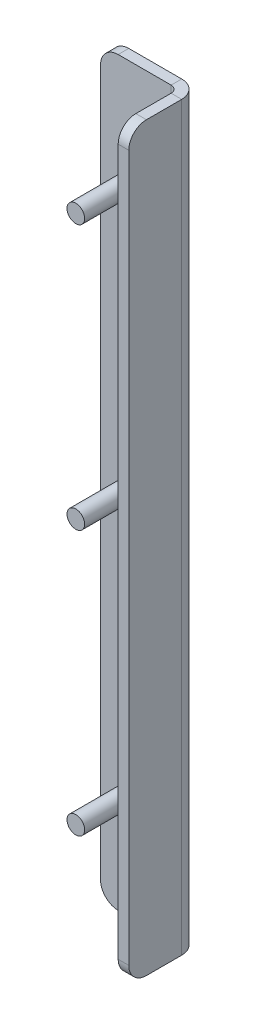
ISO-10303-21;
HEADER;
FILE_DESCRIPTION(('STEP AP214'),'2;1');
FILE_NAME('part.step','',(''),(''),'','','');
FILE_SCHEMA(('AUTOMOTIVE_DESIGN { 1 0 10303 214 1 1 1 1 }'));
ENDSEC;
DATA;
#1=APPLICATION_CONTEXT('core data for automotive mechanical design processes');
#2=APPLICATION_PROTOCOL_DEFINITION('international standard','automotive_design',2000,#1);
#3=PRODUCT_CONTEXT('',#1,'mechanical');
#4=PRODUCT('Part','Part','',(#3));
#5=PRODUCT_RELATED_PRODUCT_CATEGORY('part','',(#4));
#6=PRODUCT_DEFINITION_FORMATION('','',#4);
#7=PRODUCT_DEFINITION_CONTEXT('part definition',#1,'design');
#8=PRODUCT_DEFINITION('design','',#6,#7);
#9=PRODUCT_DEFINITION_SHAPE('','',#8);
#10=(LENGTH_UNIT() NAMED_UNIT(*) SI_UNIT(.MILLI.,.METRE.));
#11=(NAMED_UNIT(*) PLANE_ANGLE_UNIT() SI_UNIT($,.RADIAN.));
#12=(NAMED_UNIT(*) SI_UNIT($,.STERADIAN.) SOLID_ANGLE_UNIT());
#13=UNCERTAINTY_MEASURE_WITH_UNIT(LENGTH_MEASURE(1.E-05),#10,'distance_accuracy_value','');
#14=(GEOMETRIC_REPRESENTATION_CONTEXT(3) GLOBAL_UNCERTAINTY_ASSIGNED_CONTEXT((#13)) GLOBAL_UNIT_ASSIGNED_CONTEXT((#10,
#11,#12)) REPRESENTATION_CONTEXT('',''));
#15=CARTESIAN_POINT('',(0.,0.,0.));
#16=DIRECTION('',(0.,0.,1.));
#17=DIRECTION('',(1.,0.,0.));
#18=AXIS2_PLACEMENT_3D('',#15,#16,#17);
#19=CARTESIAN_POINT('',(-12.5,105.,-3.));
#20=DIRECTION('',(0.,1.,0.));
#21=DIRECTION('',(0.,0.,1.));
#22=AXIS2_PLACEMENT_3D('',#19,#20,#21);
#23=PLANE('',#22);
#24=DIRECTION('',(-1.,0.,0.));
#25=VECTOR('',#24,1.);
#26=CARTESIAN_POINT('',(-12.5,105.,-3.));
#27=LINE('',#26,#25);
#28=CARTESIAN_POINT('',(7.49999999999998,105.,-3.00000000000001));
#29=VERTEX_POINT('',#28);
#30=CARTESIAN_POINT('',(-7.50000000000001,105.,-3.));
#31=VERTEX_POINT('',#30);
#32=EDGE_CURVE('E219',#29,#31,#27,.T.);
#33=ORIENTED_EDGE('',*,*,#32,.T.);
#34=DIRECTION('',(0.,0.,1.));
#35=VECTOR('',#34,1.);
#36=CARTESIAN_POINT('',(-7.50000000000001,105.,-3.));
#37=LINE('',#36,#35);
#38=CARTESIAN_POINT('',(-7.50000000000001,105.,0.));
#39=VERTEX_POINT('',#38);
#40=EDGE_CURVE('E247',#31,#39,#37,.T.);
#41=ORIENTED_EDGE('',*,*,#40,.T.);
#42=DIRECTION('',(-1.,0.,0.));
#43=VECTOR('',#42,1.);
#44=CARTESIAN_POINT('',(-12.5,105.,0.));
#45=LINE('',#44,#43);
#46=CARTESIAN_POINT('',(7.49999999999999,105.,0.));
#47=VERTEX_POINT('',#46);
#48=EDGE_CURVE('E216',#47,#39,#45,.T.);
#49=ORIENTED_EDGE('',*,*,#48,.F.);
#50=DIRECTION('',(0.,0.,-1.));
#51=VECTOR('',#50,1.);
#52=CARTESIAN_POINT('',(7.5,105.,0.));
#53=LINE('',#52,#51);
#54=EDGE_CURVE('E205',#47,#29,#53,.T.);
#55=ORIENTED_EDGE('',*,*,#54,.T.);
#56=EDGE_LOOP('',(#33,#41,#49,#55));
#57=FACE_BOUND('',#56,.T.);
#58=ADVANCED_FACE('F58',(#57),#23,.T.);
#59=CARTESIAN_POINT('',(0.,0.,-3.));
#60=DIRECTION('',(0.,0.,1.));
#61=DIRECTION('',(1.,0.,0.));
#62=AXIS2_PLACEMENT_3D('',#59,#60,#61);
#63=PLANE('',#62);
#64=DIRECTION('',(0.,-1.,0.));
#65=VECTOR('',#64,1.);
#66=CARTESIAN_POINT('',(-12.5,105.,-3.));
#67=LINE('',#66,#65);
#68=CARTESIAN_POINT('',(-12.5,100.,-3.));
#69=VERTEX_POINT('',#68);
#70=CARTESIAN_POINT('',(-12.5,-100.,-3.));
#71=VERTEX_POINT('',#70);
#72=EDGE_CURVE('E222',#69,#71,#67,.T.);
#73=ORIENTED_EDGE('',*,*,#72,.F.);
#74=CARTESIAN_POINT('',(-7.50000000000001,100.,-3.));
#75=DIRECTION('',(0.,0.,1.));
#76=DIRECTION('',(1.,0.,0.));
#77=AXIS2_PLACEMENT_3D('',#74,#75,#76);
#78=CIRCLE('',#77,5.);
#79=EDGE_CURVE('E260',#69,#31,#78,.F.);
#80=ORIENTED_EDGE('',*,*,#79,.T.);
#81=ORIENTED_EDGE('',*,*,#32,.F.);
#82=DIRECTION('',(0.,1.,0.));
#83=VECTOR('',#82,1.);
#84=CARTESIAN_POINT('',(7.49999999999998,105.,-3.00000000000001));
#85=LINE('',#84,#83);
#86=CARTESIAN_POINT('',(7.5,-105.,-3.));
#87=VERTEX_POINT('',#86);
#88=EDGE_CURVE('E156',#29,#87,#85,.F.);
#89=ORIENTED_EDGE('',*,*,#88,.T.);
#90=DIRECTION('',(1.,0.,0.));
#91=VECTOR('',#90,1.);
#92=CARTESIAN_POINT('',(-12.5,-105.,-3.));
#93=LINE('',#92,#91);
#94=CARTESIAN_POINT('',(-7.49999999999999,-105.,-3.));
#95=VERTEX_POINT('',#94);
#96=EDGE_CURVE('E225',#95,#87,#93,.T.);
#97=ORIENTED_EDGE('',*,*,#96,.F.);
#98=CARTESIAN_POINT('',(-7.49999999999999,-100.,-3.));
#99=DIRECTION('',(0.,0.,1.));
#100=DIRECTION('',(1.,0.,0.));
#101=AXIS2_PLACEMENT_3D('',#98,#99,#100);
#102=CIRCLE('',#101,5.);
#103=EDGE_CURVE('E78',#95,#71,#102,.F.);
#104=ORIENTED_EDGE('',*,*,#103,.T.);
#105=EDGE_LOOP('',(#73,#80,#81,#89,#97,#104));
#106=FACE_BOUND('',#105,.T.);
#107=ADVANCED_FACE('F280',(#106),#63,.F.);
#108=CARTESIAN_POINT('',(0.,0.,0.));
#109=DIRECTION('',(0.,0.,1.));
#110=DIRECTION('',(1.,0.,0.));
#111=AXIS2_PLACEMENT_3D('',#108,#109,#110);
#112=PLANE('',#111);
#113=CARTESIAN_POINT('',(-4.49999999999998,75.,0.));
#114=DIRECTION('',(0.,0.,1.));
#115=DIRECTION('',(1.,0.,0.));
#116=AXIS2_PLACEMENT_3D('',#113,#114,#115);
#117=CIRCLE('',#116,2.5);
#118=CARTESIAN_POINT('',(-1.99999999999998,75.,0.));
#119=VERTEX_POINT('',#118);
#120=EDGE_CURVE('E368',#119,#119,#117,.T.);
#121=ORIENTED_EDGE('',*,*,#120,.F.);
#122=EDGE_LOOP('',(#121));
#123=FACE_BOUND('',#122,.T.);
#124=CARTESIAN_POINT('',(-4.49999999999998,-75.,0.));
#125=DIRECTION('',(0.,0.,1.));
#126=DIRECTION('',(1.,0.,0.));
#127=AXIS2_PLACEMENT_3D('',#124,#125,#126);
#128=CIRCLE('',#127,2.5);
#129=CARTESIAN_POINT('',(-1.99999999999998,-75.,0.));
#130=VERTEX_POINT('',#129);
#131=EDGE_CURVE('E367',#130,#130,#128,.T.);
#132=ORIENTED_EDGE('',*,*,#131,.F.);
#133=EDGE_LOOP('',(#132));
#134=FACE_BOUND('',#133,.T.);
#135=CARTESIAN_POINT('',(-4.5,0.,0.));
#136=DIRECTION('',(0.,0.,1.));
#137=DIRECTION('',(1.,0.,0.));
#138=AXIS2_PLACEMENT_3D('',#135,#136,#137);
#139=CIRCLE('',#138,2.5);
#140=CARTESIAN_POINT('',(-1.99999999999999,0.,0.));
#141=VERTEX_POINT('',#140);
#142=EDGE_CURVE('E377',#141,#141,#139,.T.);
#143=ORIENTED_EDGE('',*,*,#142,.F.);
#144=EDGE_LOOP('',(#143));
#145=FACE_BOUND('',#144,.T.);
#146=ORIENTED_EDGE('',*,*,#48,.T.);
#147=CARTESIAN_POINT('',(-7.50000000000001,100.,0.));
#148=DIRECTION('',(0.,0.,1.));
#149=DIRECTION('',(1.,0.,0.));
#150=AXIS2_PLACEMENT_3D('',#147,#148,#149);
#151=CIRCLE('',#150,5.);
#152=CARTESIAN_POINT('',(-12.5,100.,0.));
#153=VERTEX_POINT('',#152);
#154=EDGE_CURVE('E252',#39,#153,#151,.T.);
#155=ORIENTED_EDGE('',*,*,#154,.T.);
#156=DIRECTION('',(0.,-1.,0.));
#157=VECTOR('',#156,1.);
#158=CARTESIAN_POINT('',(-12.5,105.,0.));
#159=LINE('',#158,#157);
#160=CARTESIAN_POINT('',(-12.5,-100.,0.));
#161=VERTEX_POINT('',#160);
#162=EDGE_CURVE('E230',#153,#161,#159,.T.);
#163=ORIENTED_EDGE('',*,*,#162,.T.);
#164=CARTESIAN_POINT('',(-7.49999999999999,-100.,0.));
#165=DIRECTION('',(0.,0.,1.));
#166=DIRECTION('',(1.,0.,0.));
#167=AXIS2_PLACEMENT_3D('',#164,#165,#166);
#168=CIRCLE('',#167,5.);
#169=CARTESIAN_POINT('',(-7.49999999999999,-105.,0.));
#170=VERTEX_POINT('',#169);
#171=EDGE_CURVE('E250',#161,#170,#168,.T.);
#172=ORIENTED_EDGE('',*,*,#171,.T.);
#173=DIRECTION('',(1.,0.,0.));
#174=VECTOR('',#173,1.);
#175=CARTESIAN_POINT('',(-12.5,-105.,0.));
#176=LINE('',#175,#174);
#177=CARTESIAN_POINT('',(7.5,-105.,0.));
#178=VERTEX_POINT('',#177);
#179=EDGE_CURVE('E223',#170,#178,#176,.T.);
#180=ORIENTED_EDGE('',*,*,#179,.T.);
#181=DIRECTION('',(0.,1.,0.));
#182=VECTOR('',#181,1.);
#183=CARTESIAN_POINT('',(7.5,105.,0.));
#184=LINE('',#183,#182);
#185=EDGE_CURVE('E209',#47,#178,#184,.F.);
#186=ORIENTED_EDGE('',*,*,#185,.F.);
#187=EDGE_LOOP('',(#146,#155,#163,#172,#180,#186));
#188=FACE_BOUND('',#187,.T.);
#189=ADVANCED_FACE('F286',(#123,#134,#145,#188),#112,.T.);
#190=CARTESIAN_POINT('',(-12.5,-105.,-3.));
#191=DIRECTION('',(0.,-1.,0.));
#192=DIRECTION('',(0.,0.,-1.));
#193=AXIS2_PLACEMENT_3D('',#190,#191,#192);
#194=PLANE('',#193);
#195=ORIENTED_EDGE('',*,*,#179,.F.);
#196=DIRECTION('',(0.,0.,1.));
#197=VECTOR('',#196,1.);
#198=CARTESIAN_POINT('',(-7.49999999999999,-105.,-3.));
#199=LINE('',#198,#197);
#200=EDGE_CURVE('E13',#170,#95,#199,.F.);
#201=ORIENTED_EDGE('',*,*,#200,.T.);
#202=ORIENTED_EDGE('',*,*,#96,.T.);
#203=DIRECTION('',(0.,0.,-1.));
#204=VECTOR('',#203,1.);
#205=CARTESIAN_POINT('',(7.5,-105.,0.));
#206=LINE('',#205,#204);
#207=EDGE_CURVE('E213',#178,#87,#206,.T.);
#208=ORIENTED_EDGE('',*,*,#207,.F.);
#209=EDGE_LOOP('',(#195,#201,#202,#208));
#210=FACE_BOUND('',#209,.T.);
#211=ADVANCED_FACE('F279',(#210),#194,.T.);
#212=CARTESIAN_POINT('',(-12.5,105.,-3.));
#213=DIRECTION('',(-1.,0.,0.));
#214=DIRECTION('',(0.,-1.,0.));
#215=AXIS2_PLACEMENT_3D('',#212,#213,#214);
#216=PLANE('',#215);
#217=ORIENTED_EDGE('',*,*,#162,.F.);
#218=DIRECTION('',(0.,0.,1.));
#219=VECTOR('',#218,1.);
#220=CARTESIAN_POINT('',(-12.5,100.,-3.));
#221=LINE('',#220,#219);
#222=EDGE_CURVE('E257',#153,#69,#221,.F.);
#223=ORIENTED_EDGE('',*,*,#222,.T.);
#224=ORIENTED_EDGE('',*,*,#72,.T.);
#225=DIRECTION('',(0.,0.,1.));
#226=VECTOR('',#225,1.);
#227=CARTESIAN_POINT('',(-12.5,-100.,-3.));
#228=LINE('',#227,#226);
#229=EDGE_CURVE('E254',#71,#161,#228,.T.);
#230=ORIENTED_EDGE('',*,*,#229,.T.);
#231=EDGE_LOOP('',(#217,#223,#224,#230));
#232=FACE_BOUND('',#231,.T.);
#233=ADVANCED_FACE('F291',(#232),#216,.T.);
#234=CARTESIAN_POINT('',(7.50000000000001,-105.,2.));
#235=DIRECTION('',(0.,-1.,0.));
#236=DIRECTION('',(0.,0.,-1.));
#237=AXIS2_PLACEMENT_3D('',#234,#235,#236);
#238=PLANE('',#237);
#239=DIRECTION('',(-1.,0.,0.));
#240=VECTOR('',#239,1.);
#241=CARTESIAN_POINT('',(12.5,-105.,1.99999999999998));
#242=LINE('',#241,#240);
#243=CARTESIAN_POINT('',(9.50000000000002,-105.,1.99999999999999));
#244=VERTEX_POINT('',#243);
#245=CARTESIAN_POINT('',(12.5,-105.,1.99999999999998));
#246=VERTEX_POINT('',#245);
#247=EDGE_CURVE('E199',#244,#246,#242,.F.);
#248=ORIENTED_EDGE('',*,*,#247,.F.);
#249=CARTESIAN_POINT('',(7.50000000000001,-105.,2.));
#250=DIRECTION('',(0.,1.,0.));
#251=DIRECTION('',(0.,0.,1.));
#252=AXIS2_PLACEMENT_3D('',#249,#250,#251);
#253=CIRCLE('',#252,2.00000000000001);
#254=EDGE_CURVE('E159',#178,#244,#253,.F.);
#255=ORIENTED_EDGE('',*,*,#254,.F.);
#256=ORIENTED_EDGE('',*,*,#207,.T.);
#257=CARTESIAN_POINT('',(7.50000000000001,-105.,2.));
#258=DIRECTION('',(0.,1.,0.));
#259=DIRECTION('',(0.,0.,1.));
#260=AXIS2_PLACEMENT_3D('',#257,#258,#259);
#261=CIRCLE('',#260,5.00000000000001);
#262=EDGE_CURVE('E204',#87,#246,#261,.F.);
#263=ORIENTED_EDGE('',*,*,#262,.T.);
#264=EDGE_LOOP('',(#248,#255,#256,#263));
#265=FACE_BOUND('',#264,.T.);
#266=ADVANCED_FACE('F277',(#265),#238,.T.);
#267=CARTESIAN_POINT('',(7.50000000000001,105.,2.));
#268=DIRECTION('',(0.,-1.,0.));
#269=DIRECTION('',(0.,0.,-1.));
#270=AXIS2_PLACEMENT_3D('',#267,#268,#269);
#271=PLANE('',#270);
#272=CARTESIAN_POINT('',(7.50000000000001,105.,2.));
#273=DIRECTION('',(0.,1.,0.));
#274=DIRECTION('',(0.,0.,1.));
#275=AXIS2_PLACEMENT_3D('',#272,#273,#274);
#276=CIRCLE('',#275,2.00000000000001);
#277=CARTESIAN_POINT('',(9.50000000000002,105.,1.99999999999999));
#278=VERTEX_POINT('',#277);
#279=EDGE_CURVE('E166',#278,#47,#276,.T.);
#280=ORIENTED_EDGE('',*,*,#279,.F.);
#281=DIRECTION('',(-1.,0.,0.));
#282=VECTOR('',#281,1.);
#283=CARTESIAN_POINT('',(9.5,105.,1.99999999999999));
#284=LINE('',#283,#282);
#285=CARTESIAN_POINT('',(12.5,105.,1.99999999999998));
#286=VERTEX_POINT('',#285);
#287=EDGE_CURVE('E163',#278,#286,#284,.F.);
#288=ORIENTED_EDGE('',*,*,#287,.T.);
#289=CARTESIAN_POINT('',(7.50000000000001,105.,2.));
#290=DIRECTION('',(0.,1.,0.));
#291=DIRECTION('',(0.,0.,1.));
#292=AXIS2_PLACEMENT_3D('',#289,#290,#291);
#293=CIRCLE('',#292,5.00000000000001);
#294=EDGE_CURVE('E148',#286,#29,#293,.T.);
#295=ORIENTED_EDGE('',*,*,#294,.T.);
#296=ORIENTED_EDGE('',*,*,#54,.F.);
#297=EDGE_LOOP('',(#280,#288,#295,#296));
#298=FACE_BOUND('',#297,.T.);
#299=ADVANCED_FACE('F164',(#298),#271,.F.);
#300=CARTESIAN_POINT('',(7.50000000000001,105.,2.));
#301=DIRECTION('',(0.,1.,0.));
#302=DIRECTION('',(1.,0.,0.));
#303=AXIS2_PLACEMENT_3D('',#300,#301,#302);
#304=CYLINDRICAL_SURFACE('',#303,5.00000000000001);
#305=ORIENTED_EDGE('',*,*,#88,.F.);
#306=ORIENTED_EDGE('',*,*,#294,.F.);
#307=DIRECTION('',(0.,1.,0.));
#308=VECTOR('',#307,1.);
#309=CARTESIAN_POINT('',(12.5,-105.,1.99999999999998));
#310=LINE('',#309,#308);
#311=EDGE_CURVE('E153',#286,#246,#310,.F.);
#312=ORIENTED_EDGE('',*,*,#311,.T.);
#313=ORIENTED_EDGE('',*,*,#262,.F.);
#314=EDGE_LOOP('',(#305,#306,#312,#313));
#315=FACE_BOUND('',#314,.T.);
#316=ADVANCED_FACE('F150',(#315),#304,.T.);
#317=CARTESIAN_POINT('',(7.50000000000001,105.,2.));
#318=DIRECTION('',(0.,1.,0.));
#319=DIRECTION('',(1.,0.,0.));
#320=AXIS2_PLACEMENT_3D('',#317,#318,#319);
#321=CYLINDRICAL_SURFACE('',#320,2.00000000000001);
#322=ORIENTED_EDGE('',*,*,#185,.T.);
#323=ORIENTED_EDGE('',*,*,#254,.T.);
#324=DIRECTION('',(0.,1.,0.));
#325=VECTOR('',#324,1.);
#326=CARTESIAN_POINT('',(9.50000000000002,-105.,1.99999999999999));
#327=LINE('',#326,#325);
#328=EDGE_CURVE('E171',#244,#278,#327,.T.);
#329=ORIENTED_EDGE('',*,*,#328,.T.);
#330=ORIENTED_EDGE('',*,*,#279,.T.);
#331=EDGE_LOOP('',(#322,#323,#329,#330));
#332=FACE_BOUND('',#331,.T.);
#333=ADVANCED_FACE('F274',(#332),#321,.F.);
#334=CARTESIAN_POINT('',(12.5,-105.,0.));
#335=DIRECTION('',(0.,1.,0.));
#336=DIRECTION('',(-1.,0.,0.));
#337=AXIS2_PLACEMENT_3D('',#334,#335,#336);
#338=PLANE('',#337);
#339=DIRECTION('',(0.,0.,-1.));
#340=VECTOR('',#339,1.);
#341=CARTESIAN_POINT('',(12.5,-105.,0.));
#342=LINE('',#341,#340);
#343=CARTESIAN_POINT('',(12.5000000000001,-105.,12.));
#344=VERTEX_POINT('',#343);
#345=EDGE_CURVE('E179',#344,#246,#342,.T.);
#346=ORIENTED_EDGE('',*,*,#345,.F.);
#347=DIRECTION('',(-1.,0.,0.));
#348=VECTOR('',#347,1.);
#349=CARTESIAN_POINT('',(12.5000000000001,-105.,12.));
#350=LINE('',#349,#348);
#351=CARTESIAN_POINT('',(9.50000000000006,-105.,12.));
#352=VERTEX_POINT('',#351);
#353=EDGE_CURVE('E66',#344,#352,#350,.T.);
#354=ORIENTED_EDGE('',*,*,#353,.T.);
#355=DIRECTION('',(0.,0.,1.));
#356=VECTOR('',#355,1.);
#357=CARTESIAN_POINT('',(9.50000000000002,-105.,0.));
#358=LINE('',#357,#356);
#359=EDGE_CURVE('E180',#352,#244,#358,.F.);
#360=ORIENTED_EDGE('',*,*,#359,.T.);
#361=ORIENTED_EDGE('',*,*,#247,.T.);
#362=EDGE_LOOP('',(#346,#354,#360,#361));
#363=FACE_BOUND('',#362,.T.);
#364=ADVANCED_FACE('F265',(#363),#338,.F.);
#365=CARTESIAN_POINT('',(12.5,105.,17.));
#366=DIRECTION('',(0.,-1.,0.));
#367=DIRECTION('',(1.,0.,0.));
#368=AXIS2_PLACEMENT_3D('',#365,#366,#367);
#369=PLANE('',#368);
#370=DIRECTION('',(0.,0.,-1.));
#371=VECTOR('',#370,1.);
#372=CARTESIAN_POINT('',(9.50000000000005,105.,17.));
#373=LINE('',#372,#371);
#374=CARTESIAN_POINT('',(9.50000000000003,105.,12.));
#375=VERTEX_POINT('',#374);
#376=EDGE_CURVE('E195',#278,#375,#373,.F.);
#377=ORIENTED_EDGE('',*,*,#376,.T.);
#378=DIRECTION('',(-1.,0.,0.));
#379=VECTOR('',#378,1.);
#380=CARTESIAN_POINT('',(12.5,105.,12.));
#381=LINE('',#380,#379);
#382=CARTESIAN_POINT('',(12.5,105.,12.));
#383=VERTEX_POINT('',#382);
#384=EDGE_CURVE('E184',#375,#383,#381,.F.);
#385=ORIENTED_EDGE('',*,*,#384,.T.);
#386=DIRECTION('',(0.,0.,1.));
#387=VECTOR('',#386,1.);
#388=CARTESIAN_POINT('',(12.5,105.,0.));
#389=LINE('',#388,#387);
#390=EDGE_CURVE('E176',#286,#383,#389,.T.);
#391=ORIENTED_EDGE('',*,*,#390,.F.);
#392=ORIENTED_EDGE('',*,*,#287,.F.);
#393=EDGE_LOOP('',(#377,#385,#391,#392));
#394=FACE_BOUND('',#393,.T.);
#395=ADVANCED_FACE('F182',(#394),#369,.F.);
#396=CARTESIAN_POINT('',(12.5,0.,0.));
#397=DIRECTION('',(-1.,0.,0.));
#398=DIRECTION('',(0.,0.,1.));
#399=AXIS2_PLACEMENT_3D('',#396,#397,#398);
#400=PLANE('',#399);
#401=ORIENTED_EDGE('',*,*,#390,.T.);
#402=CARTESIAN_POINT('',(12.5,100.,12.));
#403=DIRECTION('',(-1.,0.,0.));
#404=DIRECTION('',(0.,0.,1.));
#405=AXIS2_PLACEMENT_3D('',#402,#403,#404);
#406=CIRCLE('',#405,5.);
#407=CARTESIAN_POINT('',(12.5,100.,17.));
#408=VERTEX_POINT('',#407);
#409=EDGE_CURVE('E245',#383,#408,#406,.F.);
#410=ORIENTED_EDGE('',*,*,#409,.T.);
#411=DIRECTION('',(0.,-1.,0.));
#412=VECTOR('',#411,1.);
#413=CARTESIAN_POINT('',(12.5000000000001,0.,17.));
#414=LINE('',#413,#412);
#415=CARTESIAN_POINT('',(12.5000000000001,-100.,17.));
#416=VERTEX_POINT('',#415);
#417=EDGE_CURVE('E185',#408,#416,#414,.T.);
#418=ORIENTED_EDGE('',*,*,#417,.T.);
#419=CARTESIAN_POINT('',(12.5000000000001,-100.,12.));
#420=DIRECTION('',(-1.,0.,0.));
#421=DIRECTION('',(0.,0.,1.));
#422=AXIS2_PLACEMENT_3D('',#419,#420,#421);
#423=CIRCLE('',#422,5.);
#424=EDGE_CURVE('E243',#416,#344,#423,.F.);
#425=ORIENTED_EDGE('',*,*,#424,.T.);
#426=ORIENTED_EDGE('',*,*,#345,.T.);
#427=ORIENTED_EDGE('',*,*,#311,.F.);
#428=EDGE_LOOP('',(#401,#410,#418,#425,#426,#427));
#429=FACE_BOUND('',#428,.T.);
#430=ADVANCED_FACE('F175',(#429),#400,.F.);
#431=CARTESIAN_POINT('',(9.5,0.,0.));
#432=DIRECTION('',(-1.,0.,0.));
#433=DIRECTION('',(0.,0.,1.));
#434=AXIS2_PLACEMENT_3D('',#431,#432,#433);
#435=PLANE('',#434);
#436=DIRECTION('',(0.,1.,0.));
#437=VECTOR('',#436,1.);
#438=CARTESIAN_POINT('',(9.50000000000007,-105.,17.));
#439=LINE('',#438,#437);
#440=CARTESIAN_POINT('',(9.50000000000005,100.,17.));
#441=VERTEX_POINT('',#440);
#442=CARTESIAN_POINT('',(9.50000000000007,-100.,17.));
#443=VERTEX_POINT('',#442);
#444=EDGE_CURVE('E189',#441,#443,#439,.F.);
#445=ORIENTED_EDGE('',*,*,#444,.F.);
#446=CARTESIAN_POINT('',(9.50000000000003,100.,12.));
#447=DIRECTION('',(-1.,0.,0.));
#448=DIRECTION('',(0.,0.,1.));
#449=AXIS2_PLACEMENT_3D('',#446,#447,#448);
#450=CIRCLE('',#449,5.);
#451=EDGE_CURVE('E240',#441,#375,#450,.T.);
#452=ORIENTED_EDGE('',*,*,#451,.T.);
#453=ORIENTED_EDGE('',*,*,#376,.F.);
#454=ORIENTED_EDGE('',*,*,#328,.F.);
#455=ORIENTED_EDGE('',*,*,#359,.F.);
#456=CARTESIAN_POINT('',(9.50000000000006,-100.,12.));
#457=DIRECTION('',(-1.,0.,0.));
#458=DIRECTION('',(0.,0.,1.));
#459=AXIS2_PLACEMENT_3D('',#456,#457,#458);
#460=CIRCLE('',#459,5.);
#461=EDGE_CURVE('E238',#352,#443,#460,.T.);
#462=ORIENTED_EDGE('',*,*,#461,.T.);
#463=EDGE_LOOP('',(#445,#452,#453,#454,#455,#462));
#464=FACE_BOUND('',#463,.T.);
#465=ADVANCED_FACE('F272',(#464),#435,.T.);
#466=CARTESIAN_POINT('',(12.5000000000001,-105.,17.));
#467=DIRECTION('',(0.,0.,-1.));
#468=DIRECTION('',(-1.,0.,0.));
#469=AXIS2_PLACEMENT_3D('',#466,#467,#468);
#470=PLANE('',#469);
#471=ORIENTED_EDGE('',*,*,#417,.F.);
#472=DIRECTION('',(-1.,0.,0.));
#473=VECTOR('',#472,1.);
#474=CARTESIAN_POINT('',(12.5,100.,17.));
#475=LINE('',#474,#473);
#476=EDGE_CURVE('E235',#408,#441,#475,.T.);
#477=ORIENTED_EDGE('',*,*,#476,.T.);
#478=ORIENTED_EDGE('',*,*,#444,.T.);
#479=DIRECTION('',(-1.,0.,0.));
#480=VECTOR('',#479,1.);
#481=CARTESIAN_POINT('',(12.5000000000001,-100.,17.));
#482=LINE('',#481,#480);
#483=EDGE_CURVE('E227',#443,#416,#482,.F.);
#484=ORIENTED_EDGE('',*,*,#483,.T.);
#485=EDGE_LOOP('',(#471,#477,#478,#484));
#486=FACE_BOUND('',#485,.T.);
#487=ADVANCED_FACE('F333',(#486),#470,.F.);
#488=CARTESIAN_POINT('',(-4.5,0.,15.));
#489=DIRECTION('',(0.,0.,-1.));
#490=DIRECTION('',(-1.,0.,0.));
#491=AXIS2_PLACEMENT_3D('',#488,#489,#490);
#492=CYLINDRICAL_SURFACE('',#491,2.5);
#493=CARTESIAN_POINT('',(-4.5,0.,15.));
#494=DIRECTION('',(0.,0.,1.));
#495=DIRECTION('',(1.,0.,0.));
#496=AXIS2_PLACEMENT_3D('',#493,#494,#495);
#497=CIRCLE('',#496,2.5);
#498=CARTESIAN_POINT('',(-1.99999999999999,0.,15.));
#499=VERTEX_POINT('',#498);
#500=EDGE_CURVE('E202',#499,#499,#497,.T.);
#501=ORIENTED_EDGE('',*,*,#500,.F.);
#502=EDGE_LOOP('',(#501));
#503=FACE_BOUND('',#502,.T.);
#504=ORIENTED_EDGE('',*,*,#142,.T.);
#505=EDGE_LOOP('',(#504));
#506=FACE_BOUND('',#505,.T.);
#507=ADVANCED_FACE('F336',(#503,#506),#492,.T.);
#508=CARTESIAN_POINT('',(-4.5,0.,15.));
#509=DIRECTION('',(0.,0.,1.));
#510=DIRECTION('',(1.,0.,0.));
#511=AXIS2_PLACEMENT_3D('',#508,#509,#510);
#512=PLANE('',#511);
#513=ORIENTED_EDGE('',*,*,#500,.T.);
#514=EDGE_LOOP('',(#513));
#515=FACE_BOUND('',#514,.T.);
#516=ADVANCED_FACE('F344',(#515),#512,.T.);
#517=CARTESIAN_POINT('',(-4.49999999999998,-75.,15.));
#518=DIRECTION('',(0.,0.,-1.));
#519=DIRECTION('',(-1.,0.,0.));
#520=AXIS2_PLACEMENT_3D('',#517,#518,#519);
#521=CYLINDRICAL_SURFACE('',#520,2.5);
#522=CARTESIAN_POINT('',(-4.49999999999998,-75.,15.));
#523=DIRECTION('',(0.,0.,1.));
#524=DIRECTION('',(1.,0.,0.));
#525=AXIS2_PLACEMENT_3D('',#522,#523,#524);
#526=CIRCLE('',#525,2.5);
#527=CARTESIAN_POINT('',(-1.99999999999998,-75.,15.));
#528=VERTEX_POINT('',#527);
#529=EDGE_CURVE('E371',#528,#528,#526,.T.);
#530=ORIENTED_EDGE('',*,*,#529,.F.);
#531=EDGE_LOOP('',(#530));
#532=FACE_BOUND('',#531,.T.);
#533=ORIENTED_EDGE('',*,*,#131,.T.);
#534=EDGE_LOOP('',(#533));
#535=FACE_BOUND('',#534,.T.);
#536=ADVANCED_FACE('F348',(#532,#535),#521,.T.);
#537=CARTESIAN_POINT('',(-4.49999999999998,-75.,15.));
#538=DIRECTION('',(0.,0.,1.));
#539=DIRECTION('',(1.,0.,0.));
#540=AXIS2_PLACEMENT_3D('',#537,#538,#539);
#541=PLANE('',#540);
#542=ORIENTED_EDGE('',*,*,#529,.T.);
#543=EDGE_LOOP('',(#542));
#544=FACE_BOUND('',#543,.T.);
#545=ADVANCED_FACE('F352',(#544),#541,.T.);
#546=CARTESIAN_POINT('',(-4.49999999999998,75.,15.));
#547=DIRECTION('',(0.,0.,-1.));
#548=DIRECTION('',(-1.,0.,0.));
#549=AXIS2_PLACEMENT_3D('',#546,#547,#548);
#550=CYLINDRICAL_SURFACE('',#549,2.5);
#551=CARTESIAN_POINT('',(-4.49999999999998,75.,15.));
#552=DIRECTION('',(0.,0.,1.));
#553=DIRECTION('',(1.,0.,0.));
#554=AXIS2_PLACEMENT_3D('',#551,#552,#553);
#555=CIRCLE('',#554,2.5);
#556=CARTESIAN_POINT('',(-1.99999999999998,75.,15.));
#557=VERTEX_POINT('',#556);
#558=EDGE_CURVE('E366',#557,#557,#555,.T.);
#559=ORIENTED_EDGE('',*,*,#558,.F.);
#560=EDGE_LOOP('',(#559));
#561=FACE_BOUND('',#560,.T.);
#562=ORIENTED_EDGE('',*,*,#120,.T.);
#563=EDGE_LOOP('',(#562));
#564=FACE_BOUND('',#563,.T.);
#565=ADVANCED_FACE('F356',(#561,#564),#550,.T.);
#566=CARTESIAN_POINT('',(-4.49999999999998,75.,15.));
#567=DIRECTION('',(0.,0.,1.));
#568=DIRECTION('',(1.,0.,0.));
#569=AXIS2_PLACEMENT_3D('',#566,#567,#568);
#570=PLANE('',#569);
#571=ORIENTED_EDGE('',*,*,#558,.T.);
#572=EDGE_LOOP('',(#571));
#573=FACE_BOUND('',#572,.T.);
#574=ADVANCED_FACE('F303',(#573),#570,.T.);
#575=CARTESIAN_POINT('',(12.5,100.,12.));
#576=DIRECTION('',(-1.,0.,0.));
#577=DIRECTION('',(0.,0.,1.));
#578=AXIS2_PLACEMENT_3D('',#575,#576,#577);
#579=CYLINDRICAL_SURFACE('',#578,5.);
#580=ORIENTED_EDGE('',*,*,#409,.F.);
#581=ORIENTED_EDGE('',*,*,#384,.F.);
#582=ORIENTED_EDGE('',*,*,#451,.F.);
#583=ORIENTED_EDGE('',*,*,#476,.F.);
#584=EDGE_LOOP('',(#580,#581,#582,#583));
#585=FACE_BOUND('',#584,.T.);
#586=ADVANCED_FACE('F297',(#585),#579,.T.);
#587=CARTESIAN_POINT('',(-7.50000000000001,100.,-3.));
#588=DIRECTION('',(0.,0.,1.));
#589=DIRECTION('',(1.,0.,0.));
#590=AXIS2_PLACEMENT_3D('',#587,#588,#589);
#591=CYLINDRICAL_SURFACE('',#590,5.);
#592=ORIENTED_EDGE('',*,*,#79,.F.);
#593=ORIENTED_EDGE('',*,*,#222,.F.);
#594=ORIENTED_EDGE('',*,*,#154,.F.);
#595=ORIENTED_EDGE('',*,*,#40,.F.);
#596=EDGE_LOOP('',(#592,#593,#594,#595));
#597=FACE_BOUND('',#596,.T.);
#598=ADVANCED_FACE('F294',(#597),#591,.T.);
#599=CARTESIAN_POINT('',(12.5000000000001,-100.,12.));
#600=DIRECTION('',(-1.,0.,0.));
#601=DIRECTION('',(0.,0.,1.));
#602=AXIS2_PLACEMENT_3D('',#599,#600,#601);
#603=CYLINDRICAL_SURFACE('',#602,5.);
#604=ORIENTED_EDGE('',*,*,#424,.F.);
#605=ORIENTED_EDGE('',*,*,#483,.F.);
#606=ORIENTED_EDGE('',*,*,#461,.F.);
#607=ORIENTED_EDGE('',*,*,#353,.F.);
#608=EDGE_LOOP('',(#604,#605,#606,#607));
#609=FACE_BOUND('',#608,.T.);
#610=ADVANCED_FACE('F296',(#609),#603,.T.);
#611=CARTESIAN_POINT('',(-7.49999999999999,-100.,-3.));
#612=DIRECTION('',(0.,0.,1.));
#613=DIRECTION('',(1.,0.,0.));
#614=AXIS2_PLACEMENT_3D('',#611,#612,#613);
#615=CYLINDRICAL_SURFACE('',#614,5.);
#616=ORIENTED_EDGE('',*,*,#103,.F.);
#617=ORIENTED_EDGE('',*,*,#200,.F.);
#618=ORIENTED_EDGE('',*,*,#171,.F.);
#619=ORIENTED_EDGE('',*,*,#229,.F.);
#620=EDGE_LOOP('',(#616,#617,#618,#619));
#621=FACE_BOUND('',#620,.T.);
#622=ADVANCED_FACE('F60',(#621),#615,.T.);
#623=CLOSED_SHELL('',(#58,#107,#189,#211,#233,#266,#299,#316,#333,#364,#395,#430,#465,#487,#507,
#516,#536,#545,#565,#574,#586,#598,#610,#622));
#624=MANIFOLD_SOLID_BREP('B2',#623);
#625=ADVANCED_BREP_SHAPE_REPRESENTATION('',(#18,#624),#14);
#626=SHAPE_DEFINITION_REPRESENTATION(#9,#625);
ENDSEC;
END-ISO-10303-21;
